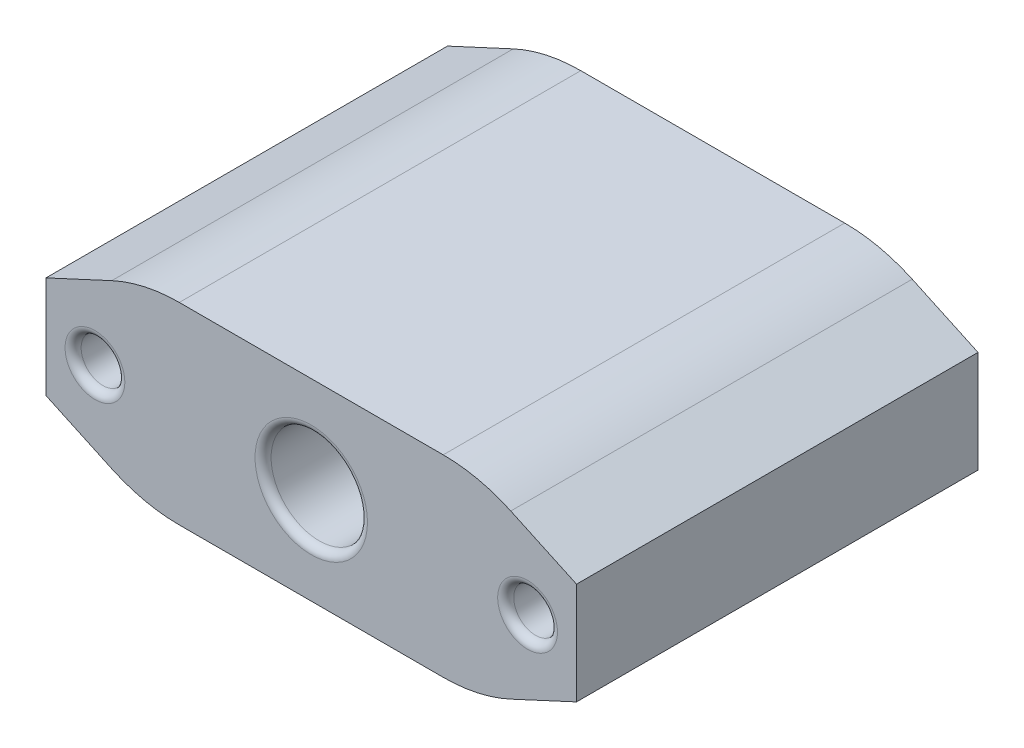
ISO-10303-21;
HEADER;
FILE_DESCRIPTION(('STEP AP214'),'2;1');
FILE_NAME('part.step','',(''),(''),'','','');
FILE_SCHEMA(('AUTOMOTIVE_DESIGN { 1 0 10303 214 1 1 1 1 }'));
ENDSEC;
DATA;
#1=APPLICATION_CONTEXT('core data for automotive mechanical design processes');
#2=APPLICATION_PROTOCOL_DEFINITION('international standard','automotive_design',2000,#1);
#3=PRODUCT_CONTEXT('',#1,'mechanical');
#4=PRODUCT('Part','Part','',(#3));
#5=PRODUCT_RELATED_PRODUCT_CATEGORY('part','',(#4));
#6=PRODUCT_DEFINITION_FORMATION('','',#4);
#7=PRODUCT_DEFINITION_CONTEXT('part definition',#1,'design');
#8=PRODUCT_DEFINITION('design','',#6,#7);
#9=PRODUCT_DEFINITION_SHAPE('','',#8);
#10=(LENGTH_UNIT() NAMED_UNIT(*) SI_UNIT(.MILLI.,.METRE.));
#11=(NAMED_UNIT(*) PLANE_ANGLE_UNIT() SI_UNIT($,.RADIAN.));
#12=(NAMED_UNIT(*) SI_UNIT($,.STERADIAN.) SOLID_ANGLE_UNIT());
#13=UNCERTAINTY_MEASURE_WITH_UNIT(LENGTH_MEASURE(1.E-05),#10,'distance_accuracy_value','');
#14=(GEOMETRIC_REPRESENTATION_CONTEXT(3) GLOBAL_UNCERTAINTY_ASSIGNED_CONTEXT((#13)) GLOBAL_UNIT_ASSIGNED_CONTEXT((#10,
#11,#12)) REPRESENTATION_CONTEXT('',''));
#15=CARTESIAN_POINT('',(0.,0.,0.));
#16=DIRECTION('',(0.,0.,1.));
#17=DIRECTION('',(1.,0.,0.));
#18=AXIS2_PLACEMENT_3D('',#15,#16,#17);
#19=CARTESIAN_POINT('',(0.,0.,25.));
#20=DIRECTION('',(0.,0.,1.));
#21=DIRECTION('',(1.,0.,0.));
#22=AXIS2_PLACEMENT_3D('',#19,#20,#21);
#23=PLANE('',#22);
#24=CARTESIAN_POINT('',(-13.4699746100887,0.,25.));
#25=DIRECTION('',(0.,0.,1.));
#26=DIRECTION('',(1.,0.,0.));
#27=AXIS2_PLACEMENT_3D('',#24,#25,#26);
#28=CIRCLE('',#27,1.8609341816038);
#29=CARTESIAN_POINT('',(-11.6090404284849,0.,25.));
#30=VERTEX_POINT('',#29);
#31=EDGE_CURVE('E11',#30,#30,#28,.F.);
#32=ORIENTED_EDGE('',*,*,#31,.T.);
#33=EDGE_LOOP('',(#32));
#34=FACE_BOUND('',#33,.T.);
#35=CARTESIAN_POINT('',(13.4699746100887,0.,25.));
#36=DIRECTION('',(0.,0.,1.));
#37=DIRECTION('',(1.,0.,0.));
#38=AXIS2_PLACEMENT_3D('',#35,#36,#37);
#39=CIRCLE('',#38,1.86093418160381);
#40=CARTESIAN_POINT('',(15.3309087916925,0.,25.));
#41=VERTEX_POINT('',#40);
#42=EDGE_CURVE('E294',#41,#41,#39,.F.);
#43=ORIENTED_EDGE('',*,*,#42,.T.);
#44=EDGE_LOOP('',(#43));
#45=FACE_BOUND('',#44,.T.);
#46=CARTESIAN_POINT('',(0.,0.,25.));
#47=DIRECTION('',(0.,0.,1.));
#48=DIRECTION('',(1.,0.,0.));
#49=AXIS2_PLACEMENT_3D('',#46,#47,#48);
#50=CIRCLE('',#49,3.5);
#51=CARTESIAN_POINT('',(3.5,0.,25.));
#52=VERTEX_POINT('',#51);
#53=EDGE_CURVE('E286',#52,#52,#50,.F.);
#54=ORIENTED_EDGE('',*,*,#53,.T.);
#55=EDGE_LOOP('',(#54));
#56=FACE_BOUND('',#55,.T.);
#57=DIRECTION('',(-0.907309221661338,0.420464001180003,0.));
#58=VECTOR('',#57,1.);
#59=CARTESIAN_POINT('',(16.5179746100887,3.17499999999998,25.));
#60=LINE('',#59,#58);
#61=CARTESIAN_POINT('',(16.5179746100887,3.17499999999998,25.));
#62=VERTEX_POINT('',#61);
#63=CARTESIAN_POINT('',(12.4221267685046,5.07309221661338,25.));
#64=VERTEX_POINT('',#63);
#65=EDGE_CURVE('E158',#62,#64,#60,.T.);
#66=ORIENTED_EDGE('',*,*,#65,.T.);
#67=CARTESIAN_POINT('',(8.21748675670452,-3.99999999999999,25.));
#68=DIRECTION('',(0.,0.,1.));
#69=DIRECTION('',(1.,0.,0.));
#70=AXIS2_PLACEMENT_3D('',#67,#68,#69);
#71=CIRCLE('',#70,10.);
#72=CARTESIAN_POINT('',(8.21748675670452,6.00000000000001,25.));
#73=VERTEX_POINT('',#72);
#74=EDGE_CURVE('E255',#64,#73,#71,.T.);
#75=ORIENTED_EDGE('',*,*,#74,.T.);
#76=DIRECTION('',(-1.,0.,0.));
#77=VECTOR('',#76,1.);
#78=CARTESIAN_POINT('',(-10.4219746100887,6.00000000000001,25.));
#79=LINE('',#78,#77);
#80=CARTESIAN_POINT('',(-8.21748675670453,6.00000000000001,25.));
#81=VERTEX_POINT('',#80);
#82=EDGE_CURVE('E161',#73,#81,#79,.T.);
#83=ORIENTED_EDGE('',*,*,#82,.T.);
#84=CARTESIAN_POINT('',(-8.21748675670453,-3.99999999999999,25.));
#85=DIRECTION('',(0.,0.,1.));
#86=DIRECTION('',(1.,0.,0.));
#87=AXIS2_PLACEMENT_3D('',#84,#85,#86);
#88=CIRCLE('',#87,10.);
#89=CARTESIAN_POINT('',(-12.4221267685046,5.07309221661338,25.));
#90=VERTEX_POINT('',#89);
#91=EDGE_CURVE('E220',#81,#90,#88,.T.);
#92=ORIENTED_EDGE('',*,*,#91,.T.);
#93=DIRECTION('',(-0.907309221661338,-0.420464001180003,0.));
#94=VECTOR('',#93,1.);
#95=CARTESIAN_POINT('',(-16.5179746100887,3.17499999999998,25.));
#96=LINE('',#95,#94);
#97=CARTESIAN_POINT('',(-16.5179746100887,3.17499999999998,25.));
#98=VERTEX_POINT('',#97);
#99=EDGE_CURVE('E167',#90,#98,#96,.T.);
#100=ORIENTED_EDGE('',*,*,#99,.T.);
#101=DIRECTION('',(0.,-1.,0.));
#102=VECTOR('',#101,1.);
#103=CARTESIAN_POINT('',(-16.5179746100887,-3.17500000000004,25.));
#104=LINE('',#103,#102);
#105=CARTESIAN_POINT('',(-16.5179746100887,-3.17500000000004,25.));
#106=VERTEX_POINT('',#105);
#107=EDGE_CURVE('E170',#98,#106,#104,.T.);
#108=ORIENTED_EDGE('',*,*,#107,.T.);
#109=DIRECTION('',(0.907309221661341,-0.420464001179996,0.));
#110=VECTOR('',#109,1.);
#111=CARTESIAN_POINT('',(-16.5179746100887,-3.17500000000004,25.));
#112=LINE('',#111,#110);
#113=CARTESIAN_POINT('',(-12.4221267685045,-5.07309221661342,25.));
#114=VERTEX_POINT('',#113);
#115=EDGE_CURVE('E199',#106,#114,#112,.T.);
#116=ORIENTED_EDGE('',*,*,#115,.T.);
#117=CARTESIAN_POINT('',(-8.21748675670456,3.99999999999999,25.));
#118=DIRECTION('',(0.,0.,1.));
#119=DIRECTION('',(1.,0.,0.));
#120=AXIS2_PLACEMENT_3D('',#117,#118,#119);
#121=CIRCLE('',#120,10.);
#122=CARTESIAN_POINT('',(-8.21748675670456,-6.00000000000001,25.));
#123=VERTEX_POINT('',#122);
#124=EDGE_CURVE('E233',#114,#123,#121,.T.);
#125=ORIENTED_EDGE('',*,*,#124,.T.);
#126=DIRECTION('',(1.,0.,0.));
#127=VECTOR('',#126,1.);
#128=CARTESIAN_POINT('',(-10.4219746100887,-6.00000000000001,25.));
#129=LINE('',#128,#127);
#130=CARTESIAN_POINT('',(8.21748675670456,-6.00000000000001,25.));
#131=VERTEX_POINT('',#130);
#132=EDGE_CURVE('E142',#123,#131,#129,.T.);
#133=ORIENTED_EDGE('',*,*,#132,.T.);
#134=CARTESIAN_POINT('',(8.21748675670456,3.99999999999999,25.));
#135=DIRECTION('',(0.,0.,1.));
#136=DIRECTION('',(1.,0.,0.));
#137=AXIS2_PLACEMENT_3D('',#134,#135,#136);
#138=CIRCLE('',#137,10.);
#139=CARTESIAN_POINT('',(12.4221267685045,-5.07309221661342,25.));
#140=VERTEX_POINT('',#139);
#141=EDGE_CURVE('E137',#131,#140,#138,.T.);
#142=ORIENTED_EDGE('',*,*,#141,.T.);
#143=DIRECTION('',(0.907309221661341,0.420464001179996,0.));
#144=VECTOR('',#143,1.);
#145=CARTESIAN_POINT('',(16.5179746100887,-3.17500000000004,25.));
#146=LINE('',#145,#144);
#147=CARTESIAN_POINT('',(16.5179746100887,-3.17500000000004,25.));
#148=VERTEX_POINT('',#147);
#149=EDGE_CURVE('E130',#140,#148,#146,.T.);
#150=ORIENTED_EDGE('',*,*,#149,.T.);
#151=DIRECTION('',(0.,1.,0.));
#152=VECTOR('',#151,1.);
#153=CARTESIAN_POINT('',(16.5179746100887,-3.17500000000004,25.));
#154=LINE('',#153,#152);
#155=EDGE_CURVE('E133',#148,#62,#154,.T.);
#156=ORIENTED_EDGE('',*,*,#155,.T.);
#157=EDGE_LOOP('',(#66,#75,#83,#92,#100,#108,#116,#125,#133,#142,#150,#156));
#158=FACE_BOUND('',#157,.T.);
#159=ADVANCED_FACE('F39',(#34,#45,#56,#158),#23,.T.);
#160=CARTESIAN_POINT('',(0.,0.,0.));
#161=DIRECTION('',(0.,0.,1.));
#162=DIRECTION('',(1.,0.,0.));
#163=AXIS2_PLACEMENT_3D('',#160,#161,#162);
#164=PLANE('',#163);
#165=CARTESIAN_POINT('',(-13.4699746100887,0.,0.));
#166=DIRECTION('',(0.,0.,1.));
#167=DIRECTION('',(1.,0.,0.));
#168=AXIS2_PLACEMENT_3D('',#165,#166,#167);
#169=CIRCLE('',#168,1.8609341816038);
#170=CARTESIAN_POINT('',(-11.6090404284849,0.,0.));
#171=VERTEX_POINT('',#170);
#172=EDGE_CURVE('E274',#171,#171,#169,.T.);
#173=ORIENTED_EDGE('',*,*,#172,.T.);
#174=EDGE_LOOP('',(#173));
#175=FACE_BOUND('',#174,.T.);
#176=CARTESIAN_POINT('',(13.4699746100887,0.,0.));
#177=DIRECTION('',(0.,0.,1.));
#178=DIRECTION('',(1.,0.,0.));
#179=AXIS2_PLACEMENT_3D('',#176,#177,#178);
#180=CIRCLE('',#179,1.86093418160381);
#181=CARTESIAN_POINT('',(15.3309087916925,0.,0.));
#182=VERTEX_POINT('',#181);
#183=EDGE_CURVE('E266',#182,#182,#180,.T.);
#184=ORIENTED_EDGE('',*,*,#183,.T.);
#185=EDGE_LOOP('',(#184));
#186=FACE_BOUND('',#185,.T.);
#187=CARTESIAN_POINT('',(0.,0.,0.));
#188=DIRECTION('',(0.,0.,1.));
#189=DIRECTION('',(1.,0.,0.));
#190=AXIS2_PLACEMENT_3D('',#187,#188,#189);
#191=CIRCLE('',#190,3.5);
#192=CARTESIAN_POINT('',(3.5,0.,0.));
#193=VERTEX_POINT('',#192);
#194=EDGE_CURVE('E258',#193,#193,#191,.T.);
#195=ORIENTED_EDGE('',*,*,#194,.T.);
#196=EDGE_LOOP('',(#195));
#197=FACE_BOUND('',#196,.T.);
#198=DIRECTION('',(-1.,0.,0.));
#199=VECTOR('',#198,1.);
#200=CARTESIAN_POINT('',(-10.4219746100887,6.00000000000001,0.));
#201=LINE('',#200,#199);
#202=CARTESIAN_POINT('',(8.21748675670452,6.00000000000001,0.));
#203=VERTEX_POINT('',#202);
#204=CARTESIAN_POINT('',(-8.21748675670453,6.00000000000001,0.));
#205=VERTEX_POINT('',#204);
#206=EDGE_CURVE('E190',#203,#205,#201,.T.);
#207=ORIENTED_EDGE('',*,*,#206,.F.);
#208=CARTESIAN_POINT('',(8.21748675670452,-3.99999999999999,0.));
#209=DIRECTION('',(0.,0.,1.));
#210=DIRECTION('',(1.,0.,0.));
#211=AXIS2_PLACEMENT_3D('',#208,#209,#210);
#212=CIRCLE('',#211,10.);
#213=CARTESIAN_POINT('',(12.4221267685046,5.07309221661338,0.));
#214=VERTEX_POINT('',#213);
#215=EDGE_CURVE('E63',#203,#214,#212,.F.);
#216=ORIENTED_EDGE('',*,*,#215,.T.);
#217=DIRECTION('',(-0.907309221661338,0.420464001180003,0.));
#218=VECTOR('',#217,1.);
#219=CARTESIAN_POINT('',(16.5179746100887,3.17499999999998,0.));
#220=LINE('',#219,#218);
#221=CARTESIAN_POINT('',(16.5179746100887,3.17499999999998,0.));
#222=VERTEX_POINT('',#221);
#223=EDGE_CURVE('E187',#222,#214,#220,.T.);
#224=ORIENTED_EDGE('',*,*,#223,.F.);
#225=DIRECTION('',(0.,1.,0.));
#226=VECTOR('',#225,1.);
#227=CARTESIAN_POINT('',(16.5179746100887,-3.17500000000004,0.));
#228=LINE('',#227,#226);
#229=CARTESIAN_POINT('',(16.5179746100887,-3.17500000000004,0.));
#230=VERTEX_POINT('',#229);
#231=EDGE_CURVE('E184',#230,#222,#228,.T.);
#232=ORIENTED_EDGE('',*,*,#231,.F.);
#233=DIRECTION('',(0.907309221661341,0.420464001179996,0.));
#234=VECTOR('',#233,1.);
#235=CARTESIAN_POINT('',(16.5179746100887,-3.17500000000004,0.));
#236=LINE('',#235,#234);
#237=CARTESIAN_POINT('',(12.4221267685045,-5.07309221661342,0.));
#238=VERTEX_POINT('',#237);
#239=EDGE_CURVE('E148',#238,#230,#236,.T.);
#240=ORIENTED_EDGE('',*,*,#239,.F.);
#241=CARTESIAN_POINT('',(8.21748675670456,3.99999999999999,0.));
#242=DIRECTION('',(0.,0.,1.));
#243=DIRECTION('',(1.,0.,0.));
#244=AXIS2_PLACEMENT_3D('',#241,#242,#243);
#245=CIRCLE('',#244,10.);
#246=CARTESIAN_POINT('',(8.21748675670456,-6.00000000000001,0.));
#247=VERTEX_POINT('',#246);
#248=EDGE_CURVE('E239',#238,#247,#245,.F.);
#249=ORIENTED_EDGE('',*,*,#248,.T.);
#250=DIRECTION('',(1.,0.,0.));
#251=VECTOR('',#250,1.);
#252=CARTESIAN_POINT('',(-10.4219746100887,-6.00000000000001,0.));
#253=LINE('',#252,#251);
#254=CARTESIAN_POINT('',(-8.21748675670456,-6.00000000000001,0.));
#255=VERTEX_POINT('',#254);
#256=EDGE_CURVE('E178',#255,#247,#253,.T.);
#257=ORIENTED_EDGE('',*,*,#256,.F.);
#258=CARTESIAN_POINT('',(-8.21748675670456,3.99999999999999,0.));
#259=DIRECTION('',(0.,0.,1.));
#260=DIRECTION('',(1.,0.,0.));
#261=AXIS2_PLACEMENT_3D('',#258,#259,#260);
#262=CIRCLE('',#261,10.);
#263=CARTESIAN_POINT('',(-12.4221267685045,-5.07309221661342,0.));
#264=VERTEX_POINT('',#263);
#265=EDGE_CURVE('E227',#255,#264,#262,.F.);
#266=ORIENTED_EDGE('',*,*,#265,.T.);
#267=DIRECTION('',(0.907309221661341,-0.420464001179996,0.));
#268=VECTOR('',#267,1.);
#269=CARTESIAN_POINT('',(-16.5179746100887,-3.17500000000004,0.));
#270=LINE('',#269,#268);
#271=CARTESIAN_POINT('',(-16.5179746100887,-3.17500000000004,0.));
#272=VERTEX_POINT('',#271);
#273=EDGE_CURVE('E174',#272,#264,#270,.T.);
#274=ORIENTED_EDGE('',*,*,#273,.F.);
#275=DIRECTION('',(0.,-1.,0.));
#276=VECTOR('',#275,1.);
#277=CARTESIAN_POINT('',(-16.5179746100887,-3.17500000000004,0.));
#278=LINE('',#277,#276);
#279=CARTESIAN_POINT('',(-16.5179746100887,3.17499999999998,0.));
#280=VERTEX_POINT('',#279);
#281=EDGE_CURVE('E196',#280,#272,#278,.T.);
#282=ORIENTED_EDGE('',*,*,#281,.F.);
#283=DIRECTION('',(-0.907309221661338,-0.420464001180003,0.));
#284=VECTOR('',#283,1.);
#285=CARTESIAN_POINT('',(-16.5179746100887,3.17499999999998,0.));
#286=LINE('',#285,#284);
#287=CARTESIAN_POINT('',(-12.4221267685046,5.07309221661338,0.));
#288=VERTEX_POINT('',#287);
#289=EDGE_CURVE('E193',#288,#280,#286,.T.);
#290=ORIENTED_EDGE('',*,*,#289,.F.);
#291=CARTESIAN_POINT('',(-8.21748675670453,-3.99999999999999,0.));
#292=DIRECTION('',(0.,0.,1.));
#293=DIRECTION('',(1.,0.,0.));
#294=AXIS2_PLACEMENT_3D('',#291,#292,#293);
#295=CIRCLE('',#294,10.);
#296=EDGE_CURVE('E212',#288,#205,#295,.F.);
#297=ORIENTED_EDGE('',*,*,#296,.T.);
#298=EDGE_LOOP('',(#207,#216,#224,#232,#240,#249,#257,#266,#274,#282,#290,#297));
#299=FACE_BOUND('',#298,.T.);
#300=ADVANCED_FACE('F314',(#175,#186,#197,#299),#164,.F.);
#301=CARTESIAN_POINT('',(-16.5179746100887,-3.17500000000004,25.));
#302=DIRECTION('',(0.420464001179996,0.907309221661341,0.));
#303=DIRECTION('',(-0.907309221661341,0.420464001179996,0.));
#304=AXIS2_PLACEMENT_3D('',#301,#302,#303);
#305=PLANE('',#304);
#306=ORIENTED_EDGE('',*,*,#273,.T.);
#307=DIRECTION('',(0.,0.,-1.));
#308=VECTOR('',#307,1.);
#309=CARTESIAN_POINT('',(-12.4221267685045,-5.07309221661342,25.));
#310=LINE('',#309,#308);
#311=EDGE_CURVE('E230',#264,#114,#310,.F.);
#312=ORIENTED_EDGE('',*,*,#311,.T.);
#313=ORIENTED_EDGE('',*,*,#115,.F.);
#314=DIRECTION('',(0.,0.,-1.));
#315=VECTOR('',#314,1.);
#316=CARTESIAN_POINT('',(-16.5179746100887,-3.17500000000004,25.));
#317=LINE('',#316,#315);
#318=EDGE_CURVE('E173',#106,#272,#317,.T.);
#319=ORIENTED_EDGE('',*,*,#318,.T.);
#320=EDGE_LOOP('',(#306,#312,#313,#319));
#321=FACE_BOUND('',#320,.T.);
#322=ADVANCED_FACE('F320',(#321),#305,.F.);
#323=CARTESIAN_POINT('',(-10.4219746100887,-6.00000000000001,25.));
#324=DIRECTION('',(0.,1.,0.));
#325=DIRECTION('',(0.,0.,1.));
#326=AXIS2_PLACEMENT_3D('',#323,#324,#325);
#327=PLANE('',#326);
#328=ORIENTED_EDGE('',*,*,#256,.T.);
#329=DIRECTION('',(0.,0.,-1.));
#330=VECTOR('',#329,1.);
#331=CARTESIAN_POINT('',(8.21748675670456,-6.00000000000001,25.));
#332=LINE('',#331,#330);
#333=EDGE_CURVE('E242',#247,#131,#332,.F.);
#334=ORIENTED_EDGE('',*,*,#333,.T.);
#335=ORIENTED_EDGE('',*,*,#132,.F.);
#336=DIRECTION('',(0.,0.,-1.));
#337=VECTOR('',#336,1.);
#338=CARTESIAN_POINT('',(-8.21748675670456,-6.00000000000001,25.));
#339=LINE('',#338,#337);
#340=EDGE_CURVE('E223',#123,#255,#339,.T.);
#341=ORIENTED_EDGE('',*,*,#340,.T.);
#342=EDGE_LOOP('',(#328,#334,#335,#341));
#343=FACE_BOUND('',#342,.T.);
#344=ADVANCED_FACE('F347',(#343),#327,.F.);
#345=CARTESIAN_POINT('',(16.5179746100887,-3.17500000000004,25.));
#346=DIRECTION('',(-0.420464001179996,0.907309221661341,0.));
#347=DIRECTION('',(-0.907309221661341,-0.420464001179996,0.));
#348=AXIS2_PLACEMENT_3D('',#345,#346,#347);
#349=PLANE('',#348);
#350=ORIENTED_EDGE('',*,*,#149,.F.);
#351=DIRECTION('',(0.,0.,-1.));
#352=VECTOR('',#351,1.);
#353=CARTESIAN_POINT('',(12.4221267685045,-5.07309221661342,25.));
#354=LINE('',#353,#352);
#355=EDGE_CURVE('E236',#140,#238,#354,.T.);
#356=ORIENTED_EDGE('',*,*,#355,.T.);
#357=ORIENTED_EDGE('',*,*,#239,.T.);
#358=DIRECTION('',(0.,0.,-1.));
#359=VECTOR('',#358,1.);
#360=CARTESIAN_POINT('',(16.5179746100887,-3.17500000000004,25.));
#361=LINE('',#360,#359);
#362=EDGE_CURVE('E145',#148,#230,#361,.T.);
#363=ORIENTED_EDGE('',*,*,#362,.F.);
#364=EDGE_LOOP('',(#350,#356,#357,#363));
#365=FACE_BOUND('',#364,.T.);
#366=ADVANCED_FACE('F146',(#365),#349,.F.);
#367=CARTESIAN_POINT('',(16.5179746100887,-3.17500000000004,25.));
#368=DIRECTION('',(-1.,0.,0.));
#369=DIRECTION('',(0.,-1.,0.));
#370=AXIS2_PLACEMENT_3D('',#367,#368,#369);
#371=PLANE('',#370);
#372=ORIENTED_EDGE('',*,*,#231,.T.);
#373=DIRECTION('',(0.,0.,-1.));
#374=VECTOR('',#373,1.);
#375=CARTESIAN_POINT('',(16.5179746100887,3.17499999999998,25.));
#376=LINE('',#375,#374);
#377=EDGE_CURVE('E153',#62,#222,#376,.T.);
#378=ORIENTED_EDGE('',*,*,#377,.F.);
#379=ORIENTED_EDGE('',*,*,#155,.F.);
#380=ORIENTED_EDGE('',*,*,#362,.T.);
#381=EDGE_LOOP('',(#372,#378,#379,#380));
#382=FACE_BOUND('',#381,.T.);
#383=ADVANCED_FACE('F155',(#382),#371,.F.);
#384=CARTESIAN_POINT('',(16.5179746100887,3.17499999999998,25.));
#385=DIRECTION('',(-0.420464001180003,-0.907309221661338,0.));
#386=DIRECTION('',(0.907309221661338,-0.420464001180003,0.));
#387=AXIS2_PLACEMENT_3D('',#384,#385,#386);
#388=PLANE('',#387);
#389=ORIENTED_EDGE('',*,*,#223,.T.);
#390=DIRECTION('',(0.,0.,-1.));
#391=VECTOR('',#390,1.);
#392=CARTESIAN_POINT('',(12.4221267685046,5.07309221661338,25.));
#393=LINE('',#392,#391);
#394=EDGE_CURVE('E55',#214,#64,#393,.F.);
#395=ORIENTED_EDGE('',*,*,#394,.T.);
#396=ORIENTED_EDGE('',*,*,#65,.F.);
#397=ORIENTED_EDGE('',*,*,#377,.T.);
#398=EDGE_LOOP('',(#389,#395,#396,#397));
#399=FACE_BOUND('',#398,.T.);
#400=ADVANCED_FACE('F339',(#399),#388,.F.);
#401=CARTESIAN_POINT('',(-10.4219746100887,6.00000000000001,25.));
#402=DIRECTION('',(0.,-1.,0.));
#403=DIRECTION('',(0.,0.,-1.));
#404=AXIS2_PLACEMENT_3D('',#401,#402,#403);
#405=PLANE('',#404);
#406=ORIENTED_EDGE('',*,*,#82,.F.);
#407=DIRECTION('',(0.,0.,-1.));
#408=VECTOR('',#407,1.);
#409=CARTESIAN_POINT('',(8.21748675670452,6.00000000000001,25.));
#410=LINE('',#409,#408);
#411=EDGE_CURVE('E247',#73,#203,#410,.T.);
#412=ORIENTED_EDGE('',*,*,#411,.T.);
#413=ORIENTED_EDGE('',*,*,#206,.T.);
#414=DIRECTION('',(0.,0.,-1.));
#415=VECTOR('',#414,1.);
#416=CARTESIAN_POINT('',(-8.21748675670453,6.00000000000001,25.));
#417=LINE('',#416,#415);
#418=EDGE_CURVE('E216',#205,#81,#417,.F.);
#419=ORIENTED_EDGE('',*,*,#418,.T.);
#420=EDGE_LOOP('',(#406,#412,#413,#419));
#421=FACE_BOUND('',#420,.T.);
#422=ADVANCED_FACE('F335',(#421),#405,.F.);
#423=CARTESIAN_POINT('',(-16.5179746100887,3.17499999999998,25.));
#424=DIRECTION('',(0.420464001180003,-0.907309221661338,0.));
#425=DIRECTION('',(0.907309221661338,0.420464001180003,0.));
#426=AXIS2_PLACEMENT_3D('',#423,#424,#425);
#427=PLANE('',#426);
#428=ORIENTED_EDGE('',*,*,#99,.F.);
#429=DIRECTION('',(0.,0.,-1.));
#430=VECTOR('',#429,1.);
#431=CARTESIAN_POINT('',(-12.4221267685046,5.07309221661338,25.));
#432=LINE('',#431,#430);
#433=EDGE_CURVE('E152',#90,#288,#432,.T.);
#434=ORIENTED_EDGE('',*,*,#433,.T.);
#435=ORIENTED_EDGE('',*,*,#289,.T.);
#436=DIRECTION('',(0.,0.,-1.));
#437=VECTOR('',#436,1.);
#438=CARTESIAN_POINT('',(-16.5179746100887,3.17499999999998,25.));
#439=LINE('',#438,#437);
#440=EDGE_CURVE('E203',#98,#280,#439,.T.);
#441=ORIENTED_EDGE('',*,*,#440,.F.);
#442=EDGE_LOOP('',(#428,#434,#435,#441));
#443=FACE_BOUND('',#442,.T.);
#444=ADVANCED_FACE('F331',(#443),#427,.F.);
#445=CARTESIAN_POINT('',(-16.5179746100887,-3.17500000000004,25.));
#446=DIRECTION('',(1.,0.,0.));
#447=DIRECTION('',(0.,1.,0.));
#448=AXIS2_PLACEMENT_3D('',#445,#446,#447);
#449=PLANE('',#448);
#450=ORIENTED_EDGE('',*,*,#281,.T.);
#451=ORIENTED_EDGE('',*,*,#318,.F.);
#452=ORIENTED_EDGE('',*,*,#107,.F.);
#453=ORIENTED_EDGE('',*,*,#440,.T.);
#454=EDGE_LOOP('',(#450,#451,#452,#453));
#455=FACE_BOUND('',#454,.T.);
#456=ADVANCED_FACE('F328',(#455),#449,.F.);
#457=CARTESIAN_POINT('',(13.4699746100887,0.,25.));
#458=DIRECTION('',(0.,0.,-1.));
#459=DIRECTION('',(-1.,0.,0.));
#460=AXIS2_PLACEMENT_3D('',#457,#458,#459);
#461=CYLINDRICAL_SURFACE('',#460,1.36093418160381);
#462=CARTESIAN_POINT('',(13.4699746100887,0.,24.5));
#463=DIRECTION('',(0.,0.,1.));
#464=DIRECTION('',(1.,0.,0.));
#465=AXIS2_PLACEMENT_3D('',#462,#463,#464);
#466=CIRCLE('',#465,1.36093418160381);
#467=CARTESIAN_POINT('',(14.8309087916925,0.,24.5));
#468=VERTEX_POINT('',#467);
#469=EDGE_CURVE('E290',#468,#468,#466,.T.);
#470=ORIENTED_EDGE('',*,*,#469,.T.);
#471=EDGE_LOOP('',(#470));
#472=FACE_BOUND('',#471,.T.);
#473=CARTESIAN_POINT('',(13.4699746100887,0.,0.5));
#474=DIRECTION('',(0.,0.,1.));
#475=DIRECTION('',(1.,0.,0.));
#476=AXIS2_PLACEMENT_3D('',#473,#474,#475);
#477=CIRCLE('',#476,1.36093418160381);
#478=CARTESIAN_POINT('',(14.8309087916925,0.,0.5));
#479=VERTEX_POINT('',#478);
#480=EDGE_CURVE('E270',#479,#479,#477,.F.);
#481=ORIENTED_EDGE('',*,*,#480,.T.);
#482=EDGE_LOOP('',(#481));
#483=FACE_BOUND('',#482,.T.);
#484=ADVANCED_FACE('F325',(#472,#483),#461,.F.);
#485=CARTESIAN_POINT('',(-13.4699746100887,0.,25.));
#486=DIRECTION('',(0.,0.,-1.));
#487=DIRECTION('',(-1.,0.,0.));
#488=AXIS2_PLACEMENT_3D('',#485,#486,#487);
#489=CYLINDRICAL_SURFACE('',#488,1.3609341816038);
#490=CARTESIAN_POINT('',(-13.4699746100887,0.,24.5));
#491=DIRECTION('',(0.,0.,1.));
#492=DIRECTION('',(1.,0.,0.));
#493=AXIS2_PLACEMENT_3D('',#490,#491,#492);
#494=CIRCLE('',#493,1.3609341816038);
#495=CARTESIAN_POINT('',(-12.1090404284849,0.,24.5));
#496=VERTEX_POINT('',#495);
#497=EDGE_CURVE('E48',#496,#496,#494,.T.);
#498=ORIENTED_EDGE('',*,*,#497,.T.);
#499=EDGE_LOOP('',(#498));
#500=FACE_BOUND('',#499,.T.);
#501=CARTESIAN_POINT('',(-13.4699746100887,0.,0.5));
#502=DIRECTION('',(0.,0.,1.));
#503=DIRECTION('',(1.,0.,0.));
#504=AXIS2_PLACEMENT_3D('',#501,#502,#503);
#505=CIRCLE('',#504,1.3609341816038);
#506=CARTESIAN_POINT('',(-12.1090404284849,0.,0.5));
#507=VERTEX_POINT('',#506);
#508=EDGE_CURVE('E278',#507,#507,#505,.F.);
#509=ORIENTED_EDGE('',*,*,#508,.T.);
#510=EDGE_LOOP('',(#509));
#511=FACE_BOUND('',#510,.T.);
#512=ADVANCED_FACE('F301',(#500,#511),#489,.F.);
#513=CARTESIAN_POINT('',(0.,0.,25.));
#514=DIRECTION('',(0.,0.,-1.));
#515=DIRECTION('',(-1.,0.,0.));
#516=AXIS2_PLACEMENT_3D('',#513,#514,#515);
#517=CYLINDRICAL_SURFACE('',#516,3.);
#518=CARTESIAN_POINT('',(0.,0.,24.5));
#519=DIRECTION('',(0.,0.,1.));
#520=DIRECTION('',(1.,0.,0.));
#521=AXIS2_PLACEMENT_3D('',#518,#519,#520);
#522=CIRCLE('',#521,3.);
#523=CARTESIAN_POINT('',(3.,0.,24.5));
#524=VERTEX_POINT('',#523);
#525=EDGE_CURVE('E282',#524,#524,#522,.T.);
#526=ORIENTED_EDGE('',*,*,#525,.T.);
#527=EDGE_LOOP('',(#526));
#528=FACE_BOUND('',#527,.T.);
#529=CARTESIAN_POINT('',(0.,0.,0.5));
#530=DIRECTION('',(0.,0.,1.));
#531=DIRECTION('',(1.,0.,0.));
#532=AXIS2_PLACEMENT_3D('',#529,#530,#531);
#533=CIRCLE('',#532,3.);
#534=CARTESIAN_POINT('',(3.,0.,0.5));
#535=VERTEX_POINT('',#534);
#536=EDGE_CURVE('E262',#535,#535,#533,.F.);
#537=ORIENTED_EDGE('',*,*,#536,.T.);
#538=EDGE_LOOP('',(#537));
#539=FACE_BOUND('',#538,.T.);
#540=ADVANCED_FACE('F358',(#528,#539),#517,.F.);
#541=CARTESIAN_POINT('',(-8.21748675670453,-3.99999999999999,25.));
#542=DIRECTION('',(0.,0.,-1.));
#543=DIRECTION('',(-1.,0.,0.));
#544=AXIS2_PLACEMENT_3D('',#541,#542,#543);
#545=CYLINDRICAL_SURFACE('',#544,10.);
#546=ORIENTED_EDGE('',*,*,#91,.F.);
#547=ORIENTED_EDGE('',*,*,#418,.F.);
#548=ORIENTED_EDGE('',*,*,#296,.F.);
#549=ORIENTED_EDGE('',*,*,#433,.F.);
#550=EDGE_LOOP('',(#546,#547,#548,#549));
#551=FACE_BOUND('',#550,.T.);
#552=ADVANCED_FACE('F354',(#551),#545,.T.);
#553=CARTESIAN_POINT('',(-8.21748675670456,3.99999999999999,25.));
#554=DIRECTION('',(0.,0.,-1.));
#555=DIRECTION('',(-1.,0.,0.));
#556=AXIS2_PLACEMENT_3D('',#553,#554,#555);
#557=CYLINDRICAL_SURFACE('',#556,10.);
#558=ORIENTED_EDGE('',*,*,#124,.F.);
#559=ORIENTED_EDGE('',*,*,#311,.F.);
#560=ORIENTED_EDGE('',*,*,#265,.F.);
#561=ORIENTED_EDGE('',*,*,#340,.F.);
#562=EDGE_LOOP('',(#558,#559,#560,#561));
#563=FACE_BOUND('',#562,.T.);
#564=ADVANCED_FACE('F357',(#563),#557,.T.);
#565=CARTESIAN_POINT('',(8.21748675670456,3.99999999999999,25.));
#566=DIRECTION('',(0.,0.,-1.));
#567=DIRECTION('',(-1.,0.,0.));
#568=AXIS2_PLACEMENT_3D('',#565,#566,#567);
#569=CYLINDRICAL_SURFACE('',#568,10.);
#570=ORIENTED_EDGE('',*,*,#141,.F.);
#571=ORIENTED_EDGE('',*,*,#333,.F.);
#572=ORIENTED_EDGE('',*,*,#248,.F.);
#573=ORIENTED_EDGE('',*,*,#355,.F.);
#574=EDGE_LOOP('',(#570,#571,#572,#573));
#575=FACE_BOUND('',#574,.T.);
#576=ADVANCED_FACE('F362',(#575),#569,.T.);
#577=CARTESIAN_POINT('',(8.21748675670452,-3.99999999999999,25.));
#578=DIRECTION('',(0.,0.,-1.));
#579=DIRECTION('',(-1.,0.,0.));
#580=AXIS2_PLACEMENT_3D('',#577,#578,#579);
#581=CYLINDRICAL_SURFACE('',#580,10.);
#582=ORIENTED_EDGE('',*,*,#74,.F.);
#583=ORIENTED_EDGE('',*,*,#394,.F.);
#584=ORIENTED_EDGE('',*,*,#215,.F.);
#585=ORIENTED_EDGE('',*,*,#411,.F.);
#586=EDGE_LOOP('',(#582,#583,#584,#585));
#587=FACE_BOUND('',#586,.T.);
#588=ADVANCED_FACE('F366',(#587),#581,.T.);
#589=CARTESIAN_POINT('',(0.,0.,0.5));
#590=DIRECTION('',(0.,0.,1.));
#591=DIRECTION('',(1.,0.,0.));
#592=AXIS2_PLACEMENT_3D('',#589,#590,#591);
#593=TOROIDAL_SURFACE('',#592,3.5,0.5);
#594=ORIENTED_EDGE('',*,*,#536,.F.);
#595=EDGE_LOOP('',(#594));
#596=FACE_BOUND('',#595,.T.);
#597=ORIENTED_EDGE('',*,*,#194,.F.);
#598=EDGE_LOOP('',(#597));
#599=FACE_BOUND('',#598,.T.);
#600=ADVANCED_FACE('F370',(#596,#599),#593,.T.);
#601=CARTESIAN_POINT('',(13.4699746100887,0.,0.5));
#602=DIRECTION('',(0.,0.,1.));
#603=DIRECTION('',(1.,0.,0.));
#604=AXIS2_PLACEMENT_3D('',#601,#602,#603);
#605=TOROIDAL_SURFACE('',#604,1.86093418160381,0.5);
#606=ORIENTED_EDGE('',*,*,#480,.F.);
#607=EDGE_LOOP('',(#606));
#608=FACE_BOUND('',#607,.T.);
#609=ORIENTED_EDGE('',*,*,#183,.F.);
#610=EDGE_LOOP('',(#609));
#611=FACE_BOUND('',#610,.T.);
#612=ADVANCED_FACE('F374',(#608,#611),#605,.T.);
#613=CARTESIAN_POINT('',(-13.4699746100887,0.,0.5));
#614=DIRECTION('',(0.,0.,1.));
#615=DIRECTION('',(1.,0.,0.));
#616=AXIS2_PLACEMENT_3D('',#613,#614,#615);
#617=TOROIDAL_SURFACE('',#616,1.8609341816038,0.5);
#618=ORIENTED_EDGE('',*,*,#508,.F.);
#619=EDGE_LOOP('',(#618));
#620=FACE_BOUND('',#619,.T.);
#621=ORIENTED_EDGE('',*,*,#172,.F.);
#622=EDGE_LOOP('',(#621));
#623=FACE_BOUND('',#622,.T.);
#624=ADVANCED_FACE('F378',(#620,#623),#617,.T.);
#625=CARTESIAN_POINT('',(0.,0.,24.5));
#626=DIRECTION('',(0.,0.,1.));
#627=DIRECTION('',(1.,0.,0.));
#628=AXIS2_PLACEMENT_3D('',#625,#626,#627);
#629=TOROIDAL_SURFACE('',#628,3.5,0.5);
#630=ORIENTED_EDGE('',*,*,#53,.F.);
#631=EDGE_LOOP('',(#630));
#632=FACE_BOUND('',#631,.T.);
#633=ORIENTED_EDGE('',*,*,#525,.F.);
#634=EDGE_LOOP('',(#633));
#635=FACE_BOUND('',#634,.T.);
#636=ADVANCED_FACE('F310',(#632,#635),#629,.T.);
#637=CARTESIAN_POINT('',(13.4699746100887,0.,24.5));
#638=DIRECTION('',(0.,0.,1.));
#639=DIRECTION('',(1.,0.,0.));
#640=AXIS2_PLACEMENT_3D('',#637,#638,#639);
#641=TOROIDAL_SURFACE('',#640,1.86093418160381,0.5);
#642=ORIENTED_EDGE('',*,*,#42,.F.);
#643=EDGE_LOOP('',(#642));
#644=FACE_BOUND('',#643,.T.);
#645=ORIENTED_EDGE('',*,*,#469,.F.);
#646=EDGE_LOOP('',(#645));
#647=FACE_BOUND('',#646,.T.);
#648=ADVANCED_FACE('F305',(#644,#647),#641,.T.);
#649=CARTESIAN_POINT('',(-13.4699746100887,0.,24.5));
#650=DIRECTION('',(0.,0.,1.));
#651=DIRECTION('',(1.,0.,0.));
#652=AXIS2_PLACEMENT_3D('',#649,#650,#651);
#653=TOROIDAL_SURFACE('',#652,1.8609341816038,0.5);
#654=ORIENTED_EDGE('',*,*,#31,.F.);
#655=EDGE_LOOP('',(#654));
#656=FACE_BOUND('',#655,.T.);
#657=ORIENTED_EDGE('',*,*,#497,.F.);
#658=EDGE_LOOP('',(#657));
#659=FACE_BOUND('',#658,.T.);
#660=ADVANCED_FACE('F41',(#656,#659),#653,.T.);
#661=CLOSED_SHELL('',(#159,#300,#322,#344,#366,#383,#400,#422,#444,#456,#484,#512,#540,#552,
#564,#576,#588,#600,#612,#624,#636,#648,#660));
#662=MANIFOLD_SOLID_BREP('B2',#661);
#663=ADVANCED_BREP_SHAPE_REPRESENTATION('',(#18,#662),#14);
#664=SHAPE_DEFINITION_REPRESENTATION(#9,#663);
ENDSEC;
END-ISO-10303-21;
